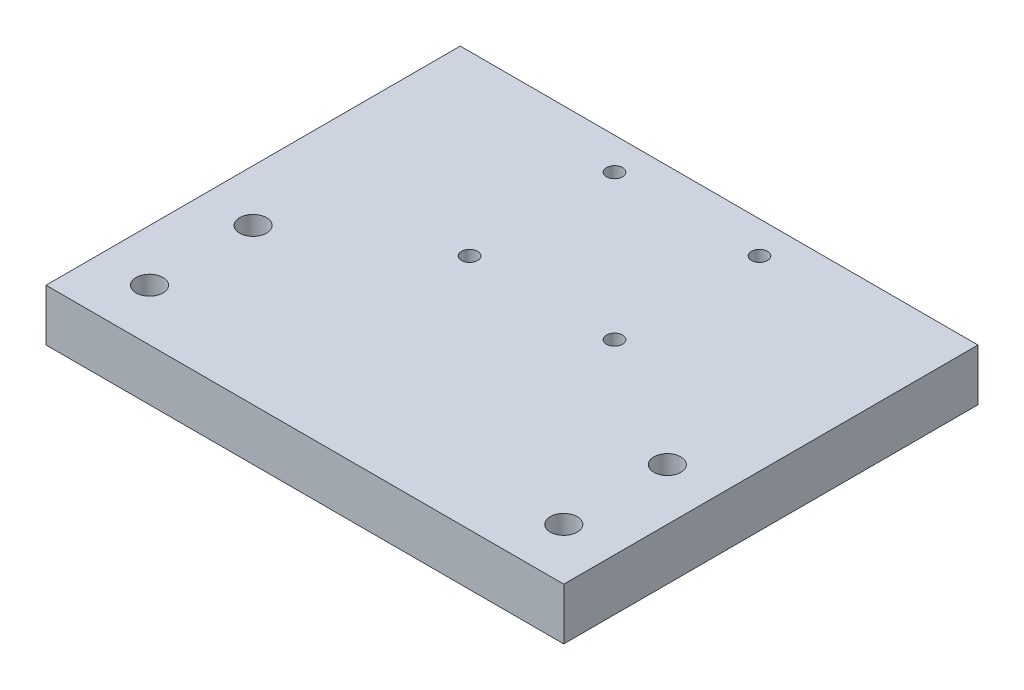
ISO-10303-21;
HEADER;
FILE_DESCRIPTION(('STEP AP214'),'2;1');
FILE_NAME('part.step','',(''),(''),'','','');
FILE_SCHEMA(('AUTOMOTIVE_DESIGN { 1 0 10303 214 1 1 1 1 }'));
ENDSEC;
DATA;
#1=APPLICATION_CONTEXT('core data for automotive mechanical design processes');
#2=APPLICATION_PROTOCOL_DEFINITION('international standard','automotive_design',2000,#1);
#3=PRODUCT_CONTEXT('',#1,'mechanical');
#4=PRODUCT('Part','Part','',(#3));
#5=PRODUCT_RELATED_PRODUCT_CATEGORY('part','',(#4));
#6=PRODUCT_DEFINITION_FORMATION('','',#4);
#7=PRODUCT_DEFINITION_CONTEXT('part definition',#1,'design');
#8=PRODUCT_DEFINITION('design','',#6,#7);
#9=PRODUCT_DEFINITION_SHAPE('','',#8);
#10=(LENGTH_UNIT() NAMED_UNIT(*) SI_UNIT(.MILLI.,.METRE.));
#11=(NAMED_UNIT(*) PLANE_ANGLE_UNIT() SI_UNIT($,.RADIAN.));
#12=(NAMED_UNIT(*) SI_UNIT($,.STERADIAN.) SOLID_ANGLE_UNIT());
#13=UNCERTAINTY_MEASURE_WITH_UNIT(LENGTH_MEASURE(1.E-05),#10,'distance_accuracy_value','');
#14=(GEOMETRIC_REPRESENTATION_CONTEXT(3) GLOBAL_UNCERTAINTY_ASSIGNED_CONTEXT((#13)) GLOBAL_UNIT_ASSIGNED_CONTEXT((#10,
#11,#12)) REPRESENTATION_CONTEXT('',''));
#15=CARTESIAN_POINT('',(0.,0.,0.));
#16=DIRECTION('',(0.,0.,1.));
#17=DIRECTION('',(1.,0.,0.));
#18=AXIS2_PLACEMENT_3D('',#15,#16,#17);
#19=CARTESIAN_POINT('',(50.,10.,-40.));
#20=DIRECTION('',(-1.,0.,0.));
#21=DIRECTION('',(0.,0.,1.));
#22=AXIS2_PLACEMENT_3D('',#19,#20,#21);
#23=PLANE('',#22);
#24=DIRECTION('',(0.,0.,-1.));
#25=VECTOR('',#24,1.);
#26=CARTESIAN_POINT('',(50.,0.,-40.));
#27=LINE('',#26,#25);
#28=CARTESIAN_POINT('',(50.,0.,40.));
#29=VERTEX_POINT('',#28);
#30=CARTESIAN_POINT('',(50.,0.,-40.));
#31=VERTEX_POINT('',#30);
#32=EDGE_CURVE('E104',#29,#31,#27,.T.);
#33=ORIENTED_EDGE('',*,*,#32,.T.);
#34=DIRECTION('',(0.,-1.,0.));
#35=VECTOR('',#34,1.);
#36=CARTESIAN_POINT('',(50.,10.,-40.));
#37=LINE('',#36,#35);
#38=CARTESIAN_POINT('',(50.,10.,-40.));
#39=VERTEX_POINT('',#38);
#40=EDGE_CURVE('E11',#39,#31,#37,.T.);
#41=ORIENTED_EDGE('',*,*,#40,.F.);
#42=DIRECTION('',(0.,0.,-1.));
#43=VECTOR('',#42,1.);
#44=CARTESIAN_POINT('',(50.,10.,-40.));
#45=LINE('',#44,#43);
#46=CARTESIAN_POINT('',(50.,10.,40.));
#47=VERTEX_POINT('',#46);
#48=EDGE_CURVE('E94',#47,#39,#45,.T.);
#49=ORIENTED_EDGE('',*,*,#48,.F.);
#50=DIRECTION('',(0.,-1.,0.));
#51=VECTOR('',#50,1.);
#52=CARTESIAN_POINT('',(50.,10.,40.));
#53=LINE('',#52,#51);
#54=EDGE_CURVE('E99',#47,#29,#53,.T.);
#55=ORIENTED_EDGE('',*,*,#54,.T.);
#56=EDGE_LOOP('',(#33,#41,#49,#55));
#57=FACE_BOUND('',#56,.T.);
#58=ADVANCED_FACE('F41',(#57),#23,.F.);
#59=CARTESIAN_POINT('',(-50.,10.,-40.));
#60=DIRECTION('',(0.,0.,1.));
#61=DIRECTION('',(1.,0.,0.));
#62=AXIS2_PLACEMENT_3D('',#59,#60,#61);
#63=PLANE('',#62);
#64=DIRECTION('',(-1.,0.,0.));
#65=VECTOR('',#64,1.);
#66=CARTESIAN_POINT('',(-50.,0.,-40.));
#67=LINE('',#66,#65);
#68=CARTESIAN_POINT('',(-50.,0.,-40.));
#69=VERTEX_POINT('',#68);
#70=EDGE_CURVE('E98',#31,#69,#67,.T.);
#71=ORIENTED_EDGE('',*,*,#70,.T.);
#72=DIRECTION('',(0.,-1.,0.));
#73=VECTOR('',#72,1.);
#74=CARTESIAN_POINT('',(-50.,10.,-40.));
#75=LINE('',#74,#73);
#76=CARTESIAN_POINT('',(-50.,10.,-40.));
#77=VERTEX_POINT('',#76);
#78=EDGE_CURVE('E47',#77,#69,#75,.T.);
#79=ORIENTED_EDGE('',*,*,#78,.F.);
#80=DIRECTION('',(-1.,0.,0.));
#81=VECTOR('',#80,1.);
#82=CARTESIAN_POINT('',(-50.,10.,-40.));
#83=LINE('',#82,#81);
#84=EDGE_CURVE('E87',#39,#77,#83,.T.);
#85=ORIENTED_EDGE('',*,*,#84,.F.);
#86=ORIENTED_EDGE('',*,*,#40,.T.);
#87=EDGE_LOOP('',(#71,#79,#85,#86));
#88=FACE_BOUND('',#87,.T.);
#89=ADVANCED_FACE('F93',(#88),#63,.F.);
#90=CARTESIAN_POINT('',(-50.,10.,-40.));
#91=DIRECTION('',(1.,0.,0.));
#92=DIRECTION('',(0.,0.,-1.));
#93=AXIS2_PLACEMENT_3D('',#90,#91,#92);
#94=PLANE('',#93);
#95=DIRECTION('',(0.,0.,1.));
#96=VECTOR('',#95,1.);
#97=CARTESIAN_POINT('',(-50.,0.,-40.));
#98=LINE('',#97,#96);
#99=CARTESIAN_POINT('',(-50.,0.,40.));
#100=VERTEX_POINT('',#99);
#101=EDGE_CURVE('E71',#69,#100,#98,.T.);
#102=ORIENTED_EDGE('',*,*,#101,.T.);
#103=DIRECTION('',(0.,-1.,0.));
#104=VECTOR('',#103,1.);
#105=CARTESIAN_POINT('',(-50.,10.,40.));
#106=LINE('',#105,#104);
#107=CARTESIAN_POINT('',(-50.,10.,40.));
#108=VERTEX_POINT('',#107);
#109=EDGE_CURVE('E97',#108,#100,#106,.T.);
#110=ORIENTED_EDGE('',*,*,#109,.F.);
#111=DIRECTION('',(0.,0.,1.));
#112=VECTOR('',#111,1.);
#113=CARTESIAN_POINT('',(-50.,10.,-40.));
#114=LINE('',#113,#112);
#115=EDGE_CURVE('E90',#77,#108,#114,.T.);
#116=ORIENTED_EDGE('',*,*,#115,.F.);
#117=ORIENTED_EDGE('',*,*,#78,.T.);
#118=EDGE_LOOP('',(#102,#110,#116,#117));
#119=FACE_BOUND('',#118,.T.);
#120=ADVANCED_FACE('F96',(#119),#94,.F.);
#121=CARTESIAN_POINT('',(-50.,10.,40.));
#122=DIRECTION('',(0.,0.,-1.));
#123=DIRECTION('',(-1.,0.,0.));
#124=AXIS2_PLACEMENT_3D('',#121,#122,#123);
#125=PLANE('',#124);
#126=DIRECTION('',(1.,0.,0.));
#127=VECTOR('',#126,1.);
#128=CARTESIAN_POINT('',(-50.,0.,40.));
#129=LINE('',#128,#127);
#130=EDGE_CURVE('E78',#100,#29,#129,.T.);
#131=ORIENTED_EDGE('',*,*,#130,.T.);
#132=ORIENTED_EDGE('',*,*,#54,.F.);
#133=DIRECTION('',(1.,0.,0.));
#134=VECTOR('',#133,1.);
#135=CARTESIAN_POINT('',(-50.,10.,40.));
#136=LINE('',#135,#134);
#137=EDGE_CURVE('E60',#108,#47,#136,.T.);
#138=ORIENTED_EDGE('',*,*,#137,.F.);
#139=ORIENTED_EDGE('',*,*,#109,.T.);
#140=EDGE_LOOP('',(#131,#132,#138,#139));
#141=FACE_BOUND('',#140,.T.);
#142=ADVANCED_FACE('F115',(#141),#125,.F.);
#143=CARTESIAN_POINT('',(0.,10.,0.));
#144=DIRECTION('',(0.,1.,0.));
#145=DIRECTION('',(0.,0.,1.));
#146=AXIS2_PLACEMENT_3D('',#143,#144,#145);
#147=PLANE('',#146);
#148=CARTESIAN_POINT('',(14.,10.,-5.80000000000004));
#149=DIRECTION('',(0.,1.,0.));
#150=DIRECTION('',(0.,0.,1.));
#151=AXIS2_PLACEMENT_3D('',#148,#149,#150);
#152=CIRCLE('',#151,1.55);
#153=CARTESIAN_POINT('',(14.,10.,-4.25000000000004));
#154=VERTEX_POINT('',#153);
#155=EDGE_CURVE('E143',#154,#154,#152,.T.);
#156=ORIENTED_EDGE('',*,*,#155,.F.);
#157=EDGE_LOOP('',(#156));
#158=FACE_BOUND('',#157,.T.);
#159=CARTESIAN_POINT('',(-14.,10.,-33.8));
#160=DIRECTION('',(0.,1.,0.));
#161=DIRECTION('',(0.,0.,1.));
#162=AXIS2_PLACEMENT_3D('',#159,#160,#161);
#163=CIRCLE('',#162,1.55);
#164=CARTESIAN_POINT('',(-14.,10.,-32.25));
#165=VERTEX_POINT('',#164);
#166=EDGE_CURVE('E151',#165,#165,#163,.T.);
#167=ORIENTED_EDGE('',*,*,#166,.F.);
#168=EDGE_LOOP('',(#167));
#169=FACE_BOUND('',#168,.T.);
#170=CARTESIAN_POINT('',(-14.,10.,-5.80000000000004));
#171=DIRECTION('',(0.,1.,0.));
#172=DIRECTION('',(0.,0.,1.));
#173=AXIS2_PLACEMENT_3D('',#170,#171,#172);
#174=CIRCLE('',#173,1.55);
#175=CARTESIAN_POINT('',(-14.,10.,-4.25000000000004));
#176=VERTEX_POINT('',#175);
#177=EDGE_CURVE('E152',#176,#176,#174,.T.);
#178=ORIENTED_EDGE('',*,*,#177,.F.);
#179=EDGE_LOOP('',(#178));
#180=FACE_BOUND('',#179,.T.);
#181=CARTESIAN_POINT('',(14.,10.,-33.8));
#182=DIRECTION('',(0.,1.,0.));
#183=DIRECTION('',(0.,0.,1.));
#184=AXIS2_PLACEMENT_3D('',#181,#182,#183);
#185=CIRCLE('',#184,1.55);
#186=CARTESIAN_POINT('',(14.,10.,-32.25));
#187=VERTEX_POINT('',#186);
#188=EDGE_CURVE('E145',#187,#187,#185,.T.);
#189=ORIENTED_EDGE('',*,*,#188,.F.);
#190=EDGE_LOOP('',(#189));
#191=FACE_BOUND('',#190,.T.);
#192=CARTESIAN_POINT('',(40.,10.,9.99999999999997));
#193=DIRECTION('',(0.,-1.,0.));
#194=DIRECTION('',(0.,0.,-1.));
#195=AXIS2_PLACEMENT_3D('',#192,#193,#194);
#196=CIRCLE('',#195,2.6);
#197=CARTESIAN_POINT('',(40.,10.,7.39999999999997));
#198=VERTEX_POINT('',#197);
#199=EDGE_CURVE('E131',#198,#198,#196,.T.);
#200=ORIENTED_EDGE('',*,*,#199,.T.);
#201=EDGE_LOOP('',(#200));
#202=FACE_BOUND('',#201,.T.);
#203=CARTESIAN_POINT('',(-40.,10.,30.));
#204=DIRECTION('',(0.,-1.,0.));
#205=DIRECTION('',(0.,0.,-1.));
#206=AXIS2_PLACEMENT_3D('',#203,#204,#205);
#207=CIRCLE('',#206,2.6);
#208=CARTESIAN_POINT('',(-40.,10.,27.4));
#209=VERTEX_POINT('',#208);
#210=EDGE_CURVE('E121',#209,#209,#207,.T.);
#211=ORIENTED_EDGE('',*,*,#210,.T.);
#212=EDGE_LOOP('',(#211));
#213=FACE_BOUND('',#212,.T.);
#214=CARTESIAN_POINT('',(-40.,10.,9.99999999999997));
#215=DIRECTION('',(0.,-1.,0.));
#216=DIRECTION('',(0.,0.,-1.));
#217=AXIS2_PLACEMENT_3D('',#214,#215,#216);
#218=CIRCLE('',#217,2.6);
#219=CARTESIAN_POINT('',(-40.,10.,7.39999999999997));
#220=VERTEX_POINT('',#219);
#221=EDGE_CURVE('E137',#220,#220,#218,.T.);
#222=ORIENTED_EDGE('',*,*,#221,.T.);
#223=EDGE_LOOP('',(#222));
#224=FACE_BOUND('',#223,.T.);
#225=CARTESIAN_POINT('',(40.,10.,30.));
#226=DIRECTION('',(0.,-1.,0.));
#227=DIRECTION('',(0.,0.,-1.));
#228=AXIS2_PLACEMENT_3D('',#225,#226,#227);
#229=CIRCLE('',#228,2.6);
#230=CARTESIAN_POINT('',(40.,10.,27.4));
#231=VERTEX_POINT('',#230);
#232=EDGE_CURVE('E110',#231,#231,#229,.T.);
#233=ORIENTED_EDGE('',*,*,#232,.T.);
#234=EDGE_LOOP('',(#233));
#235=FACE_BOUND('',#234,.T.);
#236=ORIENTED_EDGE('',*,*,#48,.T.);
#237=ORIENTED_EDGE('',*,*,#84,.T.);
#238=ORIENTED_EDGE('',*,*,#115,.T.);
#239=ORIENTED_EDGE('',*,*,#137,.T.);
#240=EDGE_LOOP('',(#236,#237,#238,#239));
#241=FACE_BOUND('',#240,.T.);
#242=ADVANCED_FACE('F89',(#158,#169,#180,#191,#202,#213,#224,#235,#241),#147,.T.);
#243=CARTESIAN_POINT('',(0.,0.,0.));
#244=DIRECTION('',(0.,1.,0.));
#245=DIRECTION('',(0.,0.,1.));
#246=AXIS2_PLACEMENT_3D('',#243,#244,#245);
#247=PLANE('',#246);
#248=CARTESIAN_POINT('',(14.,0.,-5.80000000000004));
#249=DIRECTION('',(0.,1.,0.));
#250=DIRECTION('',(0.,0.,1.));
#251=AXIS2_PLACEMENT_3D('',#248,#249,#250);
#252=CIRCLE('',#251,1.55);
#253=CARTESIAN_POINT('',(14.,0.,-4.25000000000004));
#254=VERTEX_POINT('',#253);
#255=EDGE_CURVE('E155',#254,#254,#252,.T.);
#256=ORIENTED_EDGE('',*,*,#255,.T.);
#257=EDGE_LOOP('',(#256));
#258=FACE_BOUND('',#257,.T.);
#259=CARTESIAN_POINT('',(-14.,0.,-33.8));
#260=DIRECTION('',(0.,1.,0.));
#261=DIRECTION('',(0.,0.,1.));
#262=AXIS2_PLACEMENT_3D('',#259,#260,#261);
#263=CIRCLE('',#262,1.55);
#264=CARTESIAN_POINT('',(-14.,0.,-32.25));
#265=VERTEX_POINT('',#264);
#266=EDGE_CURVE('E149',#265,#265,#263,.T.);
#267=ORIENTED_EDGE('',*,*,#266,.T.);
#268=EDGE_LOOP('',(#267));
#269=FACE_BOUND('',#268,.T.);
#270=CARTESIAN_POINT('',(-14.,0.,-5.80000000000004));
#271=DIRECTION('',(0.,1.,0.));
#272=DIRECTION('',(0.,0.,1.));
#273=AXIS2_PLACEMENT_3D('',#270,#271,#272);
#274=CIRCLE('',#273,1.55);
#275=CARTESIAN_POINT('',(-14.,0.,-4.25000000000004));
#276=VERTEX_POINT('',#275);
#277=EDGE_CURVE('E158',#276,#276,#274,.T.);
#278=ORIENTED_EDGE('',*,*,#277,.T.);
#279=EDGE_LOOP('',(#278));
#280=FACE_BOUND('',#279,.T.);
#281=CARTESIAN_POINT('',(14.,0.,-33.8));
#282=DIRECTION('',(0.,1.,0.));
#283=DIRECTION('',(0.,0.,1.));
#284=AXIS2_PLACEMENT_3D('',#281,#282,#283);
#285=CIRCLE('',#284,1.55);
#286=CARTESIAN_POINT('',(14.,0.,-32.25));
#287=VERTEX_POINT('',#286);
#288=EDGE_CURVE('E136',#287,#287,#285,.T.);
#289=ORIENTED_EDGE('',*,*,#288,.T.);
#290=EDGE_LOOP('',(#289));
#291=FACE_BOUND('',#290,.T.);
#292=CARTESIAN_POINT('',(40.,0.,9.99999999999997));
#293=DIRECTION('',(0.,-1.,0.));
#294=DIRECTION('',(0.,0.,-1.));
#295=AXIS2_PLACEMENT_3D('',#292,#293,#294);
#296=CIRCLE('',#295,2.6);
#297=CARTESIAN_POINT('',(40.,0.,7.39999999999997));
#298=VERTEX_POINT('',#297);
#299=EDGE_CURVE('E122',#298,#298,#296,.T.);
#300=ORIENTED_EDGE('',*,*,#299,.F.);
#301=EDGE_LOOP('',(#300));
#302=FACE_BOUND('',#301,.T.);
#303=CARTESIAN_POINT('',(-40.,0.,30.));
#304=DIRECTION('',(0.,-1.,0.));
#305=DIRECTION('',(0.,0.,-1.));
#306=AXIS2_PLACEMENT_3D('',#303,#304,#305);
#307=CIRCLE('',#306,2.6);
#308=CARTESIAN_POINT('',(-40.,0.,27.4));
#309=VERTEX_POINT('',#308);
#310=EDGE_CURVE('E130',#309,#309,#307,.T.);
#311=ORIENTED_EDGE('',*,*,#310,.F.);
#312=EDGE_LOOP('',(#311));
#313=FACE_BOUND('',#312,.T.);
#314=CARTESIAN_POINT('',(-40.,0.,9.99999999999997));
#315=DIRECTION('',(0.,-1.,0.));
#316=DIRECTION('',(0.,0.,-1.));
#317=AXIS2_PLACEMENT_3D('',#314,#315,#316);
#318=CIRCLE('',#317,2.6);
#319=CARTESIAN_POINT('',(-40.,0.,7.39999999999997));
#320=VERTEX_POINT('',#319);
#321=EDGE_CURVE('E129',#320,#320,#318,.T.);
#322=ORIENTED_EDGE('',*,*,#321,.F.);
#323=EDGE_LOOP('',(#322));
#324=FACE_BOUND('',#323,.T.);
#325=CARTESIAN_POINT('',(40.,0.,30.));
#326=DIRECTION('',(0.,-1.,0.));
#327=DIRECTION('',(0.,0.,-1.));
#328=AXIS2_PLACEMENT_3D('',#325,#326,#327);
#329=CIRCLE('',#328,2.6);
#330=CARTESIAN_POINT('',(40.,0.,27.4));
#331=VERTEX_POINT('',#330);
#332=EDGE_CURVE('E117',#331,#331,#329,.T.);
#333=ORIENTED_EDGE('',*,*,#332,.F.);
#334=EDGE_LOOP('',(#333));
#335=FACE_BOUND('',#334,.T.);
#336=ORIENTED_EDGE('',*,*,#32,.F.);
#337=ORIENTED_EDGE('',*,*,#130,.F.);
#338=ORIENTED_EDGE('',*,*,#101,.F.);
#339=ORIENTED_EDGE('',*,*,#70,.F.);
#340=EDGE_LOOP('',(#336,#337,#338,#339));
#341=FACE_BOUND('',#340,.T.);
#342=ADVANCED_FACE('F114',(#258,#269,#280,#291,#302,#313,#324,#335,#341),#247,.F.);
#343=CARTESIAN_POINT('',(40.,10.,30.));
#344=DIRECTION('',(0.,-1.,0.));
#345=DIRECTION('',(0.,0.,-1.));
#346=AXIS2_PLACEMENT_3D('',#343,#344,#345);
#347=CYLINDRICAL_SURFACE('',#346,2.6);
#348=ORIENTED_EDGE('',*,*,#232,.F.);
#349=EDGE_LOOP('',(#348));
#350=FACE_BOUND('',#349,.T.);
#351=ORIENTED_EDGE('',*,*,#332,.T.);
#352=EDGE_LOOP('',(#351));
#353=FACE_BOUND('',#352,.T.);
#354=ADVANCED_FACE('F185',(#350,#353),#347,.F.);
#355=CARTESIAN_POINT('',(-40.,10.,9.99999999999997));
#356=DIRECTION('',(0.,-1.,0.));
#357=DIRECTION('',(0.,0.,-1.));
#358=AXIS2_PLACEMENT_3D('',#355,#356,#357);
#359=CYLINDRICAL_SURFACE('',#358,2.6);
#360=ORIENTED_EDGE('',*,*,#221,.F.);
#361=EDGE_LOOP('',(#360));
#362=FACE_BOUND('',#361,.T.);
#363=ORIENTED_EDGE('',*,*,#321,.T.);
#364=EDGE_LOOP('',(#363));
#365=FACE_BOUND('',#364,.T.);
#366=ADVANCED_FACE('F184',(#362,#365),#359,.F.);
#367=CARTESIAN_POINT('',(-40.,10.,30.));
#368=DIRECTION('',(0.,-1.,0.));
#369=DIRECTION('',(0.,0.,-1.));
#370=AXIS2_PLACEMENT_3D('',#367,#368,#369);
#371=CYLINDRICAL_SURFACE('',#370,2.6);
#372=ORIENTED_EDGE('',*,*,#210,.F.);
#373=EDGE_LOOP('',(#372));
#374=FACE_BOUND('',#373,.T.);
#375=ORIENTED_EDGE('',*,*,#310,.T.);
#376=EDGE_LOOP('',(#375));
#377=FACE_BOUND('',#376,.T.);
#378=ADVANCED_FACE('F227',(#374,#377),#371,.F.);
#379=CARTESIAN_POINT('',(40.,10.,9.99999999999997));
#380=DIRECTION('',(0.,-1.,0.));
#381=DIRECTION('',(0.,0.,-1.));
#382=AXIS2_PLACEMENT_3D('',#379,#380,#381);
#383=CYLINDRICAL_SURFACE('',#382,2.6);
#384=ORIENTED_EDGE('',*,*,#199,.F.);
#385=EDGE_LOOP('',(#384));
#386=FACE_BOUND('',#385,.T.);
#387=ORIENTED_EDGE('',*,*,#299,.T.);
#388=EDGE_LOOP('',(#387));
#389=FACE_BOUND('',#388,.T.);
#390=ADVANCED_FACE('F238',(#386,#389),#383,.F.);
#391=CARTESIAN_POINT('',(14.,0.,-33.8));
#392=DIRECTION('',(0.,1.,0.));
#393=DIRECTION('',(0.,0.,1.));
#394=AXIS2_PLACEMENT_3D('',#391,#392,#393);
#395=CYLINDRICAL_SURFACE('',#394,1.55);
#396=ORIENTED_EDGE('',*,*,#288,.F.);
#397=EDGE_LOOP('',(#396));
#398=FACE_BOUND('',#397,.T.);
#399=ORIENTED_EDGE('',*,*,#188,.T.);
#400=EDGE_LOOP('',(#399));
#401=FACE_BOUND('',#400,.T.);
#402=ADVANCED_FACE('F250',(#398,#401),#395,.F.);
#403=CARTESIAN_POINT('',(-14.,0.,-5.80000000000004));
#404=DIRECTION('',(0.,1.,0.));
#405=DIRECTION('',(0.,0.,1.));
#406=AXIS2_PLACEMENT_3D('',#403,#404,#405);
#407=CYLINDRICAL_SURFACE('',#406,1.55);
#408=ORIENTED_EDGE('',*,*,#277,.F.);
#409=EDGE_LOOP('',(#408));
#410=FACE_BOUND('',#409,.T.);
#411=ORIENTED_EDGE('',*,*,#177,.T.);
#412=EDGE_LOOP('',(#411));
#413=FACE_BOUND('',#412,.T.);
#414=ADVANCED_FACE('F168',(#410,#413),#407,.F.);
#415=CARTESIAN_POINT('',(-14.,0.,-33.8));
#416=DIRECTION('',(0.,1.,0.));
#417=DIRECTION('',(0.,0.,1.));
#418=AXIS2_PLACEMENT_3D('',#415,#416,#417);
#419=CYLINDRICAL_SURFACE('',#418,1.55);
#420=ORIENTED_EDGE('',*,*,#266,.F.);
#421=EDGE_LOOP('',(#420));
#422=FACE_BOUND('',#421,.T.);
#423=ORIENTED_EDGE('',*,*,#166,.T.);
#424=EDGE_LOOP('',(#423));
#425=FACE_BOUND('',#424,.T.);
#426=ADVANCED_FACE('F276',(#422,#425),#419,.F.);
#427=CARTESIAN_POINT('',(14.,0.,-5.80000000000004));
#428=DIRECTION('',(0.,1.,0.));
#429=DIRECTION('',(0.,0.,1.));
#430=AXIS2_PLACEMENT_3D('',#427,#428,#429);
#431=CYLINDRICAL_SURFACE('',#430,1.55);
#432=ORIENTED_EDGE('',*,*,#255,.F.);
#433=EDGE_LOOP('',(#432));
#434=FACE_BOUND('',#433,.T.);
#435=ORIENTED_EDGE('',*,*,#155,.T.);
#436=EDGE_LOOP('',(#435));
#437=FACE_BOUND('',#436,.T.);
#438=ADVANCED_FACE('F290',(#434,#437),#431,.F.);
#439=CLOSED_SHELL('',(#58,#89,#120,#142,#242,#342,#354,#366,#378,#390,#402,#414,#426,#438));
#440=MANIFOLD_SOLID_BREP('B2',#439);
#441=ADVANCED_BREP_SHAPE_REPRESENTATION('',(#18,#440),#14);
#442=SHAPE_DEFINITION_REPRESENTATION(#9,#441);
ENDSEC;
END-ISO-10303-21;
